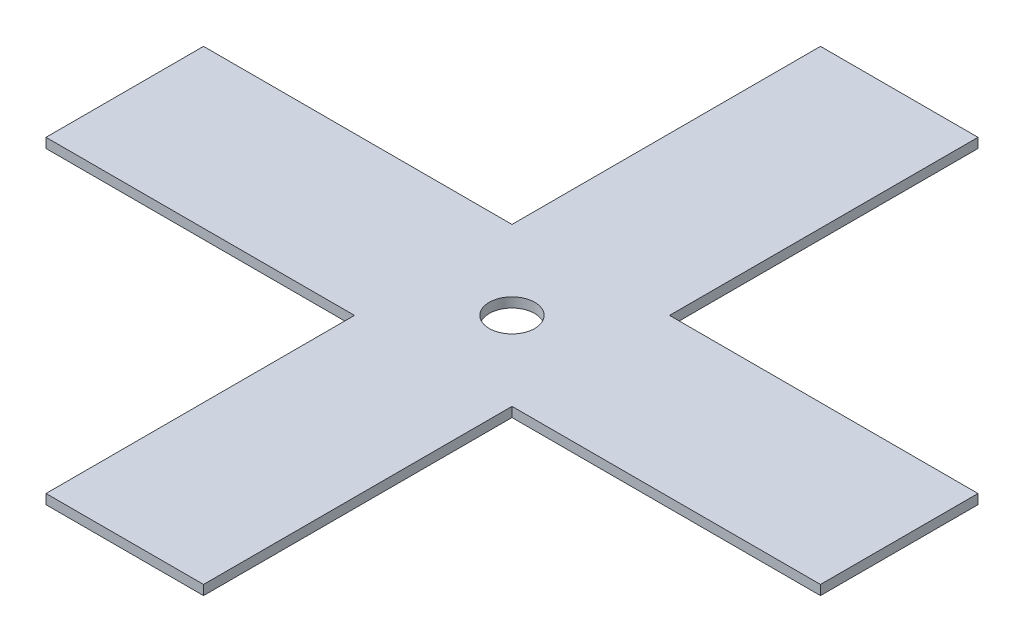
ISO-10303-21;
HEADER;
FILE_DESCRIPTION(('STEP AP214'),'2;1');
FILE_NAME('part.step','',(''),(''),'','','');
FILE_SCHEMA(('AUTOMOTIVE_DESIGN { 1 0 10303 214 1 1 1 1 }'));
ENDSEC;
DATA;
#1=APPLICATION_CONTEXT('core data for automotive mechanical design processes');
#2=APPLICATION_PROTOCOL_DEFINITION('international standard','automotive_design',2000,#1);
#3=PRODUCT_CONTEXT('',#1,'mechanical');
#4=PRODUCT('Part','Part','',(#3));
#5=PRODUCT_RELATED_PRODUCT_CATEGORY('part','',(#4));
#6=PRODUCT_DEFINITION_FORMATION('','',#4);
#7=PRODUCT_DEFINITION_CONTEXT('part definition',#1,'design');
#8=PRODUCT_DEFINITION('design','',#6,#7);
#9=PRODUCT_DEFINITION_SHAPE('','',#8);
#10=(LENGTH_UNIT() NAMED_UNIT(*) SI_UNIT(.MILLI.,.METRE.));
#11=(NAMED_UNIT(*) PLANE_ANGLE_UNIT() SI_UNIT($,.RADIAN.));
#12=(NAMED_UNIT(*) SI_UNIT($,.STERADIAN.) SOLID_ANGLE_UNIT());
#13=UNCERTAINTY_MEASURE_WITH_UNIT(LENGTH_MEASURE(1.E-05),#10,'distance_accuracy_value','');
#14=(GEOMETRIC_REPRESENTATION_CONTEXT(3) GLOBAL_UNCERTAINTY_ASSIGNED_CONTEXT((#13)) GLOBAL_UNIT_ASSIGNED_CONTEXT((#10,
#11,#12)) REPRESENTATION_CONTEXT('',''));
#15=CARTESIAN_POINT('',(0.,0.,0.));
#16=DIRECTION('',(0.,0.,1.));
#17=DIRECTION('',(1.,0.,0.));
#18=AXIS2_PLACEMENT_3D('',#15,#16,#17);
#19=CARTESIAN_POINT('',(0.,1.175,0.));
#20=DIRECTION('',(0.,-1.,0.));
#21=DIRECTION('',(0.,0.,-1.));
#22=AXIS2_PLACEMENT_3D('',#19,#20,#21);
#23=PLANE('',#22);
#24=DIRECTION('',(1.,0.,0.));
#25=VECTOR('',#24,1.);
#26=CARTESIAN_POINT('',(19.05,1.175,0.));
#27=LINE('',#26,#25);
#28=CARTESIAN_POINT('',(0.,1.175,0.));
#29=VERTEX_POINT('',#28);
#30=CARTESIAN_POINT('',(19.05,1.175,0.));
#31=VERTEX_POINT('',#30);
#32=EDGE_CURVE('E177',#29,#31,#27,.T.);
#33=ORIENTED_EDGE('',*,*,#32,.T.);
#34=DIRECTION('',(0.,0.,-1.));
#35=VECTOR('',#34,1.);
#36=CARTESIAN_POINT('',(19.05,1.175,-37.3));
#37=LINE('',#36,#35);
#38=CARTESIAN_POINT('',(19.05,1.175,-37.3));
#39=VERTEX_POINT('',#38);
#40=EDGE_CURVE('E105',#31,#39,#37,.T.);
#41=ORIENTED_EDGE('',*,*,#40,.T.);
#42=DIRECTION('',(1.,0.,0.));
#43=VECTOR('',#42,1.);
#44=CARTESIAN_POINT('',(56.35,1.175,-37.3));
#45=LINE('',#44,#43);
#46=CARTESIAN_POINT('',(56.35,1.175,-37.3));
#47=VERTEX_POINT('',#46);
#48=EDGE_CURVE('E204',#39,#47,#45,.T.);
#49=ORIENTED_EDGE('',*,*,#48,.T.);
#50=DIRECTION('',(0.,0.,-1.));
#51=VECTOR('',#50,1.);
#52=CARTESIAN_POINT('',(56.35,1.175,-56.35));
#53=LINE('',#52,#51);
#54=CARTESIAN_POINT('',(56.35,1.175,-56.35));
#55=VERTEX_POINT('',#54);
#56=EDGE_CURVE('E223',#47,#55,#53,.T.);
#57=ORIENTED_EDGE('',*,*,#56,.T.);
#58=DIRECTION('',(-1.,0.,0.));
#59=VECTOR('',#58,1.);
#60=CARTESIAN_POINT('',(19.05,1.175,-56.35));
#61=LINE('',#60,#59);
#62=CARTESIAN_POINT('',(19.05,1.175,-56.35));
#63=VERTEX_POINT('',#62);
#64=EDGE_CURVE('E220',#55,#63,#61,.T.);
#65=ORIENTED_EDGE('',*,*,#64,.T.);
#66=DIRECTION('',(0.,0.,-1.));
#67=VECTOR('',#66,1.);
#68=CARTESIAN_POINT('',(19.05,1.175,-93.65));
#69=LINE('',#68,#67);
#70=CARTESIAN_POINT('',(19.05,1.175,-93.65));
#71=VERTEX_POINT('',#70);
#72=EDGE_CURVE('E222',#63,#71,#69,.T.);
#73=ORIENTED_EDGE('',*,*,#72,.T.);
#74=DIRECTION('',(-1.,0.,0.));
#75=VECTOR('',#74,1.);
#76=CARTESIAN_POINT('',(0.,1.175,-93.65));
#77=LINE('',#76,#75);
#78=CARTESIAN_POINT('',(0.,1.175,-93.65));
#79=VERTEX_POINT('',#78);
#80=EDGE_CURVE('E225',#71,#79,#77,.T.);
#81=ORIENTED_EDGE('',*,*,#80,.T.);
#82=DIRECTION('',(0.,0.,1.));
#83=VECTOR('',#82,1.);
#84=CARTESIAN_POINT('',(0.,1.175,-56.35));
#85=LINE('',#84,#83);
#86=CARTESIAN_POINT('',(0.,1.175,-56.35));
#87=VERTEX_POINT('',#86);
#88=EDGE_CURVE('E231',#79,#87,#85,.T.);
#89=ORIENTED_EDGE('',*,*,#88,.T.);
#90=DIRECTION('',(-1.,0.,0.));
#91=VECTOR('',#90,1.);
#92=CARTESIAN_POINT('',(-37.3,1.175,-56.35));
#93=LINE('',#92,#91);
#94=CARTESIAN_POINT('',(-37.3,1.175,-56.35));
#95=VERTEX_POINT('',#94);
#96=EDGE_CURVE('E136',#87,#95,#93,.T.);
#97=ORIENTED_EDGE('',*,*,#96,.T.);
#98=DIRECTION('',(0.,0.,1.));
#99=VECTOR('',#98,1.);
#100=CARTESIAN_POINT('',(-37.3,1.175,-37.3));
#101=LINE('',#100,#99);
#102=CARTESIAN_POINT('',(-37.3,1.175,-37.3));
#103=VERTEX_POINT('',#102);
#104=EDGE_CURVE('E130',#95,#103,#101,.T.);
#105=ORIENTED_EDGE('',*,*,#104,.T.);
#106=DIRECTION('',(1.,0.,0.));
#107=VECTOR('',#106,1.);
#108=CARTESIAN_POINT('',(0.,1.175,-37.3));
#109=LINE('',#108,#107);
#110=CARTESIAN_POINT('',(0.,1.175,-37.3));
#111=VERTEX_POINT('',#110);
#112=EDGE_CURVE('E134',#103,#111,#109,.T.);
#113=ORIENTED_EDGE('',*,*,#112,.T.);
#114=DIRECTION('',(0.,0.,1.));
#115=VECTOR('',#114,1.);
#116=CARTESIAN_POINT('',(0.,1.175,0.));
#117=LINE('',#116,#115);
#118=EDGE_CURVE('E50',#111,#29,#117,.T.);
#119=ORIENTED_EDGE('',*,*,#118,.T.);
#120=EDGE_LOOP('',(#33,#41,#49,#57,#65,#73,#81,#89,#97,#105,#113,#119));
#121=FACE_BOUND('',#120,.T.);
#122=CARTESIAN_POINT('',(9.52500000000001,1.175,-46.825));
#123=DIRECTION('',(0.,1.,0.));
#124=DIRECTION('',(0.,0.,1.));
#125=AXIS2_PLACEMENT_3D('',#122,#123,#124);
#126=CIRCLE('',#125,2.75);
#127=CARTESIAN_POINT('',(9.52500000000001,1.175,-44.075));
#128=VERTEX_POINT('',#127);
#129=EDGE_CURVE('E158',#128,#128,#126,.T.);
#130=ORIENTED_EDGE('',*,*,#129,.F.);
#131=EDGE_LOOP('',(#130));
#132=FACE_BOUND('',#131,.T.);
#133=ADVANCED_FACE('F33',(#121,#132),#23,.F.);
#134=CARTESIAN_POINT('',(0.,0.,0.));
#135=DIRECTION('',(0.,-1.,0.));
#136=DIRECTION('',(0.,0.,-1.));
#137=AXIS2_PLACEMENT_3D('',#134,#135,#136);
#138=PLANE('',#137);
#139=DIRECTION('',(1.,0.,0.));
#140=VECTOR('',#139,1.);
#141=CARTESIAN_POINT('',(19.05,0.,0.));
#142=LINE('',#141,#140);
#143=CARTESIAN_POINT('',(0.,0.,0.));
#144=VERTEX_POINT('',#143);
#145=CARTESIAN_POINT('',(19.05,0.,0.));
#146=VERTEX_POINT('',#145);
#147=EDGE_CURVE('E154',#144,#146,#142,.T.);
#148=ORIENTED_EDGE('',*,*,#147,.F.);
#149=DIRECTION('',(0.,0.,1.));
#150=VECTOR('',#149,1.);
#151=CARTESIAN_POINT('',(0.,0.,0.));
#152=LINE('',#151,#150);
#153=CARTESIAN_POINT('',(0.,0.,-37.3));
#154=VERTEX_POINT('',#153);
#155=EDGE_CURVE('E97',#154,#144,#152,.T.);
#156=ORIENTED_EDGE('',*,*,#155,.F.);
#157=DIRECTION('',(1.,0.,0.));
#158=VECTOR('',#157,1.);
#159=CARTESIAN_POINT('',(0.,0.,-37.3));
#160=LINE('',#159,#158);
#161=CARTESIAN_POINT('',(-37.3,0.,-37.3));
#162=VERTEX_POINT('',#161);
#163=EDGE_CURVE('E91',#162,#154,#160,.T.);
#164=ORIENTED_EDGE('',*,*,#163,.F.);
#165=DIRECTION('',(0.,0.,1.));
#166=VECTOR('',#165,1.);
#167=CARTESIAN_POINT('',(-37.3,0.,-37.3));
#168=LINE('',#167,#166);
#169=CARTESIAN_POINT('',(-37.3,0.,-56.35));
#170=VERTEX_POINT('',#169);
#171=EDGE_CURVE('E144',#170,#162,#168,.T.);
#172=ORIENTED_EDGE('',*,*,#171,.F.);
#173=DIRECTION('',(-1.,0.,0.));
#174=VECTOR('',#173,1.);
#175=CARTESIAN_POINT('',(-37.3,0.,-56.35));
#176=LINE('',#175,#174);
#177=CARTESIAN_POINT('',(0.,0.,-56.35));
#178=VERTEX_POINT('',#177);
#179=EDGE_CURVE('E172',#178,#170,#176,.T.);
#180=ORIENTED_EDGE('',*,*,#179,.F.);
#181=DIRECTION('',(0.,0.,1.));
#182=VECTOR('',#181,1.);
#183=CARTESIAN_POINT('',(0.,0.,-56.35));
#184=LINE('',#183,#182);
#185=CARTESIAN_POINT('',(0.,0.,-93.65));
#186=VERTEX_POINT('',#185);
#187=EDGE_CURVE('E170',#186,#178,#184,.T.);
#188=ORIENTED_EDGE('',*,*,#187,.F.);
#189=DIRECTION('',(-1.,0.,0.));
#190=VECTOR('',#189,1.);
#191=CARTESIAN_POINT('',(0.,0.,-93.65));
#192=LINE('',#191,#190);
#193=CARTESIAN_POINT('',(19.05,0.,-93.65));
#194=VERTEX_POINT('',#193);
#195=EDGE_CURVE('E168',#194,#186,#192,.T.);
#196=ORIENTED_EDGE('',*,*,#195,.F.);
#197=DIRECTION('',(0.,0.,-1.));
#198=VECTOR('',#197,1.);
#199=CARTESIAN_POINT('',(19.05,0.,-93.65));
#200=LINE('',#199,#198);
#201=CARTESIAN_POINT('',(19.05,0.,-56.35));
#202=VERTEX_POINT('',#201);
#203=EDGE_CURVE('E166',#202,#194,#200,.T.);
#204=ORIENTED_EDGE('',*,*,#203,.F.);
#205=DIRECTION('',(-1.,0.,0.));
#206=VECTOR('',#205,1.);
#207=CARTESIAN_POINT('',(19.05,0.,-56.35));
#208=LINE('',#207,#206);
#209=CARTESIAN_POINT('',(56.35,0.,-56.35));
#210=VERTEX_POINT('',#209);
#211=EDGE_CURVE('E164',#210,#202,#208,.T.);
#212=ORIENTED_EDGE('',*,*,#211,.F.);
#213=DIRECTION('',(0.,0.,-1.));
#214=VECTOR('',#213,1.);
#215=CARTESIAN_POINT('',(56.35,0.,-56.35));
#216=LINE('',#215,#214);
#217=CARTESIAN_POINT('',(56.35,0.,-37.3));
#218=VERTEX_POINT('',#217);
#219=EDGE_CURVE('E162',#218,#210,#216,.T.);
#220=ORIENTED_EDGE('',*,*,#219,.F.);
#221=DIRECTION('',(1.,0.,0.));
#222=VECTOR('',#221,1.);
#223=CARTESIAN_POINT('',(56.35,0.,-37.3));
#224=LINE('',#223,#222);
#225=CARTESIAN_POINT('',(19.05,0.,-37.3));
#226=VERTEX_POINT('',#225);
#227=EDGE_CURVE('E160',#226,#218,#224,.T.);
#228=ORIENTED_EDGE('',*,*,#227,.F.);
#229=DIRECTION('',(0.,0.,-1.));
#230=VECTOR('',#229,1.);
#231=CARTESIAN_POINT('',(19.05,0.,-37.3));
#232=LINE('',#231,#230);
#233=EDGE_CURVE('E157',#146,#226,#232,.T.);
#234=ORIENTED_EDGE('',*,*,#233,.F.);
#235=EDGE_LOOP('',(#148,#156,#164,#172,#180,#188,#196,#204,#212,#220,#228,#234));
#236=FACE_BOUND('',#235,.T.);
#237=CARTESIAN_POINT('',(9.52500000000001,0.,-46.825));
#238=DIRECTION('',(0.,1.,0.));
#239=DIRECTION('',(0.,0.,1.));
#240=AXIS2_PLACEMENT_3D('',#237,#238,#239);
#241=CIRCLE('',#240,2.75);
#242=CARTESIAN_POINT('',(9.52500000000001,0.,-44.075));
#243=VERTEX_POINT('',#242);
#244=EDGE_CURVE('E378',#243,#243,#241,.T.);
#245=ORIENTED_EDGE('',*,*,#244,.T.);
#246=EDGE_LOOP('',(#245));
#247=FACE_BOUND('',#246,.T.);
#248=ADVANCED_FACE('F208',(#236,#247),#138,.T.);
#249=CARTESIAN_POINT('',(19.05,1.175,0.));
#250=DIRECTION('',(0.,0.,-1.));
#251=DIRECTION('',(-1.,0.,0.));
#252=AXIS2_PLACEMENT_3D('',#249,#250,#251);
#253=PLANE('',#252);
#254=ORIENTED_EDGE('',*,*,#147,.T.);
#255=DIRECTION('',(0.,-1.,0.));
#256=VECTOR('',#255,1.);
#257=CARTESIAN_POINT('',(19.05,1.175,0.));
#258=LINE('',#257,#256);
#259=EDGE_CURVE('E11',#31,#146,#258,.T.);
#260=ORIENTED_EDGE('',*,*,#259,.F.);
#261=ORIENTED_EDGE('',*,*,#32,.F.);
#262=DIRECTION('',(0.,-1.,0.));
#263=VECTOR('',#262,1.);
#264=CARTESIAN_POINT('',(0.,1.175,0.));
#265=LINE('',#264,#263);
#266=EDGE_CURVE('E150',#29,#144,#265,.T.);
#267=ORIENTED_EDGE('',*,*,#266,.T.);
#268=EDGE_LOOP('',(#254,#260,#261,#267));
#269=FACE_BOUND('',#268,.T.);
#270=ADVANCED_FACE('F35',(#269),#253,.F.);
#271=CARTESIAN_POINT('',(19.05,1.175,-37.3));
#272=DIRECTION('',(-1.,0.,0.));
#273=DIRECTION('',(0.,0.,1.));
#274=AXIS2_PLACEMENT_3D('',#271,#272,#273);
#275=PLANE('',#274);
#276=ORIENTED_EDGE('',*,*,#233,.T.);
#277=DIRECTION('',(0.,-1.,0.));
#278=VECTOR('',#277,1.);
#279=CARTESIAN_POINT('',(19.05,1.175,-37.3));
#280=LINE('',#279,#278);
#281=EDGE_CURVE('E42',#39,#226,#280,.T.);
#282=ORIENTED_EDGE('',*,*,#281,.F.);
#283=ORIENTED_EDGE('',*,*,#40,.F.);
#284=ORIENTED_EDGE('',*,*,#259,.T.);
#285=EDGE_LOOP('',(#276,#282,#283,#284));
#286=FACE_BOUND('',#285,.T.);
#287=ADVANCED_FACE('F265',(#286),#275,.F.);
#288=CARTESIAN_POINT('',(56.35,1.175,-37.3));
#289=DIRECTION('',(0.,0.,-1.));
#290=DIRECTION('',(-1.,0.,0.));
#291=AXIS2_PLACEMENT_3D('',#288,#289,#290);
#292=PLANE('',#291);
#293=ORIENTED_EDGE('',*,*,#227,.T.);
#294=DIRECTION('',(0.,-1.,0.));
#295=VECTOR('',#294,1.);
#296=CARTESIAN_POINT('',(56.35,1.175,-37.3));
#297=LINE('',#296,#295);
#298=EDGE_CURVE('E196',#47,#218,#297,.T.);
#299=ORIENTED_EDGE('',*,*,#298,.F.);
#300=ORIENTED_EDGE('',*,*,#48,.F.);
#301=ORIENTED_EDGE('',*,*,#281,.T.);
#302=EDGE_LOOP('',(#293,#299,#300,#301));
#303=FACE_BOUND('',#302,.T.);
#304=ADVANCED_FACE('F202',(#303),#292,.F.);
#305=CARTESIAN_POINT('',(56.35,1.175,-56.35));
#306=DIRECTION('',(-1.,0.,0.));
#307=DIRECTION('',(0.,0.,1.));
#308=AXIS2_PLACEMENT_3D('',#305,#306,#307);
#309=PLANE('',#308);
#310=ORIENTED_EDGE('',*,*,#219,.T.);
#311=DIRECTION('',(0.,-1.,0.));
#312=VECTOR('',#311,1.);
#313=CARTESIAN_POINT('',(56.35,1.175,-56.35));
#314=LINE('',#313,#312);
#315=EDGE_CURVE('E193',#55,#210,#314,.T.);
#316=ORIENTED_EDGE('',*,*,#315,.F.);
#317=ORIENTED_EDGE('',*,*,#56,.F.);
#318=ORIENTED_EDGE('',*,*,#298,.T.);
#319=EDGE_LOOP('',(#310,#316,#317,#318));
#320=FACE_BOUND('',#319,.T.);
#321=ADVANCED_FACE('F214',(#320),#309,.F.);
#322=CARTESIAN_POINT('',(19.05,1.175,-56.35));
#323=DIRECTION('',(0.,0.,1.));
#324=DIRECTION('',(1.,0.,0.));
#325=AXIS2_PLACEMENT_3D('',#322,#323,#324);
#326=PLANE('',#325);
#327=ORIENTED_EDGE('',*,*,#211,.T.);
#328=DIRECTION('',(0.,-1.,0.));
#329=VECTOR('',#328,1.);
#330=CARTESIAN_POINT('',(19.05,1.175,-56.35));
#331=LINE('',#330,#329);
#332=EDGE_CURVE('E190',#63,#202,#331,.T.);
#333=ORIENTED_EDGE('',*,*,#332,.F.);
#334=ORIENTED_EDGE('',*,*,#64,.F.);
#335=ORIENTED_EDGE('',*,*,#315,.T.);
#336=EDGE_LOOP('',(#327,#333,#334,#335));
#337=FACE_BOUND('',#336,.T.);
#338=ADVANCED_FACE('F218',(#337),#326,.F.);
#339=CARTESIAN_POINT('',(19.05,1.175,-93.65));
#340=DIRECTION('',(-1.,0.,0.));
#341=DIRECTION('',(0.,0.,1.));
#342=AXIS2_PLACEMENT_3D('',#339,#340,#341);
#343=PLANE('',#342);
#344=ORIENTED_EDGE('',*,*,#203,.T.);
#345=DIRECTION('',(0.,-1.,0.));
#346=VECTOR('',#345,1.);
#347=CARTESIAN_POINT('',(19.05,1.175,-93.65));
#348=LINE('',#347,#346);
#349=EDGE_CURVE('E187',#71,#194,#348,.T.);
#350=ORIENTED_EDGE('',*,*,#349,.F.);
#351=ORIENTED_EDGE('',*,*,#72,.F.);
#352=ORIENTED_EDGE('',*,*,#332,.T.);
#353=EDGE_LOOP('',(#344,#350,#351,#352));
#354=FACE_BOUND('',#353,.T.);
#355=ADVANCED_FACE('F278',(#354),#343,.F.);
#356=CARTESIAN_POINT('',(0.,1.175,-93.65));
#357=DIRECTION('',(0.,0.,1.));
#358=DIRECTION('',(1.,0.,0.));
#359=AXIS2_PLACEMENT_3D('',#356,#357,#358);
#360=PLANE('',#359);
#361=ORIENTED_EDGE('',*,*,#195,.T.);
#362=DIRECTION('',(0.,-1.,0.));
#363=VECTOR('',#362,1.);
#364=CARTESIAN_POINT('',(0.,1.175,-93.65));
#365=LINE('',#364,#363);
#366=EDGE_CURVE('E184',#79,#186,#365,.T.);
#367=ORIENTED_EDGE('',*,*,#366,.F.);
#368=ORIENTED_EDGE('',*,*,#80,.F.);
#369=ORIENTED_EDGE('',*,*,#349,.T.);
#370=EDGE_LOOP('',(#361,#367,#368,#369));
#371=FACE_BOUND('',#370,.T.);
#372=ADVANCED_FACE('F281',(#371),#360,.F.);
#373=CARTESIAN_POINT('',(0.,1.175,-56.35));
#374=DIRECTION('',(1.,0.,0.));
#375=DIRECTION('',(0.,0.,-1.));
#376=AXIS2_PLACEMENT_3D('',#373,#374,#375);
#377=PLANE('',#376);
#378=ORIENTED_EDGE('',*,*,#187,.T.);
#379=DIRECTION('',(0.,-1.,0.));
#380=VECTOR('',#379,1.);
#381=CARTESIAN_POINT('',(0.,1.175,-56.35));
#382=LINE('',#381,#380);
#383=EDGE_CURVE('E181',#87,#178,#382,.T.);
#384=ORIENTED_EDGE('',*,*,#383,.F.);
#385=ORIENTED_EDGE('',*,*,#88,.F.);
#386=ORIENTED_EDGE('',*,*,#366,.T.);
#387=EDGE_LOOP('',(#378,#384,#385,#386));
#388=FACE_BOUND('',#387,.T.);
#389=ADVANCED_FACE('F237',(#388),#377,.F.);
#390=CARTESIAN_POINT('',(-37.3,1.175,-56.35));
#391=DIRECTION('',(0.,0.,1.));
#392=DIRECTION('',(1.,0.,0.));
#393=AXIS2_PLACEMENT_3D('',#390,#391,#392);
#394=PLANE('',#393);
#395=ORIENTED_EDGE('',*,*,#179,.T.);
#396=DIRECTION('',(0.,-1.,0.));
#397=VECTOR('',#396,1.);
#398=CARTESIAN_POINT('',(-37.3,1.175,-56.35));
#399=LINE('',#398,#397);
#400=EDGE_CURVE('E145',#95,#170,#399,.T.);
#401=ORIENTED_EDGE('',*,*,#400,.F.);
#402=ORIENTED_EDGE('',*,*,#96,.F.);
#403=ORIENTED_EDGE('',*,*,#383,.T.);
#404=EDGE_LOOP('',(#395,#401,#402,#403));
#405=FACE_BOUND('',#404,.T.);
#406=ADVANCED_FACE('F241',(#405),#394,.F.);
#407=CARTESIAN_POINT('',(-37.3,1.175,-37.3));
#408=DIRECTION('',(1.,0.,0.));
#409=DIRECTION('',(0.,0.,-1.));
#410=AXIS2_PLACEMENT_3D('',#407,#408,#409);
#411=PLANE('',#410);
#412=ORIENTED_EDGE('',*,*,#171,.T.);
#413=DIRECTION('',(0.,-1.,0.));
#414=VECTOR('',#413,1.);
#415=CARTESIAN_POINT('',(-37.3,1.175,-37.3));
#416=LINE('',#415,#414);
#417=EDGE_CURVE('E141',#103,#162,#416,.T.);
#418=ORIENTED_EDGE('',*,*,#417,.F.);
#419=ORIENTED_EDGE('',*,*,#104,.F.);
#420=ORIENTED_EDGE('',*,*,#400,.T.);
#421=EDGE_LOOP('',(#412,#418,#419,#420));
#422=FACE_BOUND('',#421,.T.);
#423=ADVANCED_FACE('F142',(#422),#411,.F.);
#424=CARTESIAN_POINT('',(0.,1.175,-37.3));
#425=DIRECTION('',(0.,0.,-1.));
#426=DIRECTION('',(-1.,0.,0.));
#427=AXIS2_PLACEMENT_3D('',#424,#425,#426);
#428=PLANE('',#427);
#429=ORIENTED_EDGE('',*,*,#163,.T.);
#430=DIRECTION('',(0.,-1.,0.));
#431=VECTOR('',#430,1.);
#432=CARTESIAN_POINT('',(0.,1.175,-37.3));
#433=LINE('',#432,#431);
#434=EDGE_CURVE('E146',#111,#154,#433,.T.);
#435=ORIENTED_EDGE('',*,*,#434,.F.);
#436=ORIENTED_EDGE('',*,*,#112,.F.);
#437=ORIENTED_EDGE('',*,*,#417,.T.);
#438=EDGE_LOOP('',(#429,#435,#436,#437));
#439=FACE_BOUND('',#438,.T.);
#440=ADVANCED_FACE('F148',(#439),#428,.F.);
#441=CARTESIAN_POINT('',(0.,1.175,0.));
#442=DIRECTION('',(1.,0.,0.));
#443=DIRECTION('',(0.,0.,-1.));
#444=AXIS2_PLACEMENT_3D('',#441,#442,#443);
#445=PLANE('',#444);
#446=ORIENTED_EDGE('',*,*,#155,.T.);
#447=ORIENTED_EDGE('',*,*,#266,.F.);
#448=ORIENTED_EDGE('',*,*,#118,.F.);
#449=ORIENTED_EDGE('',*,*,#434,.T.);
#450=EDGE_LOOP('',(#446,#447,#448,#449));
#451=FACE_BOUND('',#450,.T.);
#452=ADVANCED_FACE('F245',(#451),#445,.F.);
#453=CARTESIAN_POINT('',(9.52500000000001,1.175,-46.825));
#454=DIRECTION('',(0.,-1.,0.));
#455=DIRECTION('',(0.,0.,-1.));
#456=AXIS2_PLACEMENT_3D('',#453,#454,#455);
#457=CYLINDRICAL_SURFACE('',#456,2.75);
#458=ORIENTED_EDGE('',*,*,#129,.T.);
#459=EDGE_LOOP('',(#458));
#460=FACE_BOUND('',#459,.T.);
#461=ORIENTED_EDGE('',*,*,#244,.F.);
#462=EDGE_LOOP('',(#461));
#463=FACE_BOUND('',#462,.T.);
#464=ADVANCED_FACE('F247',(#460,#463),#457,.F.);
#465=CLOSED_SHELL('',(#133,#248,#270,#287,#304,#321,#338,#355,#372,#389,#406,#423,#440,#452,#464));
#466=MANIFOLD_SOLID_BREP('B2',#465);
#467=ADVANCED_BREP_SHAPE_REPRESENTATION('',(#18,#466),#14);
#468=SHAPE_DEFINITION_REPRESENTATION(#9,#467);
ENDSEC;
END-ISO-10303-21;
